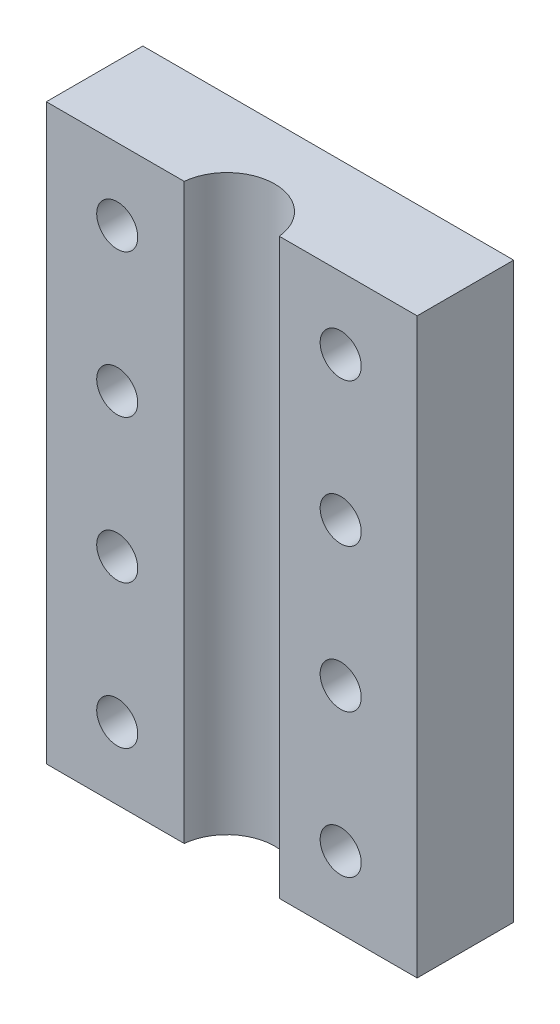
ISO-10303-21;
HEADER;
FILE_DESCRIPTION(('STEP AP214'),'2;1');
FILE_NAME('part.step','',(''),(''),'','','');
FILE_SCHEMA(('AUTOMOTIVE_DESIGN { 1 0 10303 214 1 1 1 1 }'));
ENDSEC;
DATA;
#1=APPLICATION_CONTEXT('core data for automotive mechanical design processes');
#2=APPLICATION_PROTOCOL_DEFINITION('international standard','automotive_design',2000,#1);
#3=PRODUCT_CONTEXT('',#1,'mechanical');
#4=PRODUCT('Part','Part','',(#3));
#5=PRODUCT_RELATED_PRODUCT_CATEGORY('part','',(#4));
#6=PRODUCT_DEFINITION_FORMATION('','',#4);
#7=PRODUCT_DEFINITION_CONTEXT('part definition',#1,'design');
#8=PRODUCT_DEFINITION('design','',#6,#7);
#9=PRODUCT_DEFINITION_SHAPE('','',#8);
#10=(LENGTH_UNIT() NAMED_UNIT(*) SI_UNIT(.MILLI.,.METRE.));
#11=(NAMED_UNIT(*) PLANE_ANGLE_UNIT() SI_UNIT($,.RADIAN.));
#12=(NAMED_UNIT(*) SI_UNIT($,.STERADIAN.) SOLID_ANGLE_UNIT());
#13=UNCERTAINTY_MEASURE_WITH_UNIT(LENGTH_MEASURE(1.E-05),#10,'distance_accuracy_value','');
#14=(GEOMETRIC_REPRESENTATION_CONTEXT(3) GLOBAL_UNCERTAINTY_ASSIGNED_CONTEXT((#13)) GLOBAL_UNIT_ASSIGNED_CONTEXT((#10,
#11,#12)) REPRESENTATION_CONTEXT('',''));
#15=CARTESIAN_POINT('',(0.,0.,0.));
#16=DIRECTION('',(0.,0.,1.));
#17=DIRECTION('',(1.,0.,0.));
#18=AXIS2_PLACEMENT_3D('',#15,#16,#17);
#19=CARTESIAN_POINT('',(-19.4,60.,0.));
#20=DIRECTION('',(0.,0.,-1.));
#21=DIRECTION('',(-1.,0.,0.));
#22=AXIS2_PLACEMENT_3D('',#19,#20,#21);
#23=PLANE('',#22);
#24=CARTESIAN_POINT('',(-11.98,52.5,0.));
#25=DIRECTION('',(0.,0.,-1.));
#26=DIRECTION('',(-1.,0.,0.));
#27=AXIS2_PLACEMENT_3D('',#24,#25,#26);
#28=CIRCLE('',#27,2.15);
#29=CARTESIAN_POINT('',(-14.13,52.5,0.));
#30=VERTEX_POINT('',#29);
#31=EDGE_CURVE('E165',#30,#30,#28,.T.);
#32=ORIENTED_EDGE('',*,*,#31,.T.);
#33=EDGE_LOOP('',(#32));
#34=FACE_BOUND('',#33,.T.);
#35=CARTESIAN_POINT('',(-11.98,37.5,0.));
#36=DIRECTION('',(0.,0.,-1.));
#37=DIRECTION('',(-1.,0.,0.));
#38=AXIS2_PLACEMENT_3D('',#35,#36,#37);
#39=CIRCLE('',#38,2.15);
#40=CARTESIAN_POINT('',(-14.13,37.5,0.));
#41=VERTEX_POINT('',#40);
#42=EDGE_CURVE('E189',#41,#41,#39,.T.);
#43=ORIENTED_EDGE('',*,*,#42,.T.);
#44=EDGE_LOOP('',(#43));
#45=FACE_BOUND('',#44,.T.);
#46=CARTESIAN_POINT('',(-11.98,22.5,0.));
#47=DIRECTION('',(0.,0.,-1.));
#48=DIRECTION('',(-1.,0.,0.));
#49=AXIS2_PLACEMENT_3D('',#46,#47,#48);
#50=CIRCLE('',#49,2.15);
#51=CARTESIAN_POINT('',(-14.13,22.5,0.));
#52=VERTEX_POINT('',#51);
#53=EDGE_CURVE('E183',#52,#52,#50,.T.);
#54=ORIENTED_EDGE('',*,*,#53,.T.);
#55=EDGE_LOOP('',(#54));
#56=FACE_BOUND('',#55,.T.);
#57=CARTESIAN_POINT('',(-11.98,7.5,0.));
#58=DIRECTION('',(0.,0.,-1.));
#59=DIRECTION('',(-1.,0.,0.));
#60=AXIS2_PLACEMENT_3D('',#57,#58,#59);
#61=CIRCLE('',#60,2.15);
#62=CARTESIAN_POINT('',(-14.13,7.5,0.));
#63=VERTEX_POINT('',#62);
#64=EDGE_CURVE('E177',#63,#63,#61,.T.);
#65=ORIENTED_EDGE('',*,*,#64,.T.);
#66=EDGE_LOOP('',(#65));
#67=FACE_BOUND('',#66,.T.);
#68=DIRECTION('',(1.,0.,0.));
#69=VECTOR('',#68,1.);
#70=CARTESIAN_POINT('',(-19.4,0.,0.));
#71=LINE('',#70,#69);
#72=CARTESIAN_POINT('',(-19.4,0.,0.));
#73=VERTEX_POINT('',#72);
#74=CARTESIAN_POINT('',(-4.9749371855331,0.,0.));
#75=VERTEX_POINT('',#74);
#76=EDGE_CURVE('E122',#73,#75,#71,.T.);
#77=ORIENTED_EDGE('',*,*,#76,.T.);
#78=DIRECTION('',(0.,1.,0.));
#79=VECTOR('',#78,1.);
#80=CARTESIAN_POINT('',(-4.9749371855331,0.,0.));
#81=LINE('',#80,#79);
#82=CARTESIAN_POINT('',(-4.9749371855331,60.,0.));
#83=VERTEX_POINT('',#82);
#84=EDGE_CURVE('E57',#75,#83,#81,.T.);
#85=ORIENTED_EDGE('',*,*,#84,.T.);
#86=DIRECTION('',(1.,0.,0.));
#87=VECTOR('',#86,1.);
#88=CARTESIAN_POINT('',(-19.4,60.,0.));
#89=LINE('',#88,#87);
#90=CARTESIAN_POINT('',(-19.4,60.,0.));
#91=VERTEX_POINT('',#90);
#92=EDGE_CURVE('E93',#91,#83,#89,.T.);
#93=ORIENTED_EDGE('',*,*,#92,.F.);
#94=DIRECTION('',(0.,-1.,0.));
#95=VECTOR('',#94,1.);
#96=CARTESIAN_POINT('',(-19.4,60.,0.));
#97=LINE('',#96,#95);
#98=EDGE_CURVE('E11',#91,#73,#97,.T.);
#99=ORIENTED_EDGE('',*,*,#98,.T.);
#100=EDGE_LOOP('',(#77,#85,#93,#99));
#101=FACE_BOUND('',#100,.T.);
#102=ADVANCED_FACE('F42',(#34,#45,#56,#67,#101),#23,.F.);
#103=CARTESIAN_POINT('',(-19.4,60.,-10.1));
#104=DIRECTION('',(1.,0.,0.));
#105=DIRECTION('',(0.,0.,-1.));
#106=AXIS2_PLACEMENT_3D('',#103,#104,#105);
#107=PLANE('',#106);
#108=DIRECTION('',(0.,0.,1.));
#109=VECTOR('',#108,1.);
#110=CARTESIAN_POINT('',(-19.4,0.,-10.1));
#111=LINE('',#110,#109);
#112=CARTESIAN_POINT('',(-19.4,0.,-10.1));
#113=VERTEX_POINT('',#112);
#114=EDGE_CURVE('E123',#113,#73,#111,.T.);
#115=ORIENTED_EDGE('',*,*,#114,.T.);
#116=ORIENTED_EDGE('',*,*,#98,.F.);
#117=DIRECTION('',(0.,0.,1.));
#118=VECTOR('',#117,1.);
#119=CARTESIAN_POINT('',(-19.4,60.,-10.1));
#120=LINE('',#119,#118);
#121=CARTESIAN_POINT('',(-19.4,60.,-10.1));
#122=VERTEX_POINT('',#121);
#123=EDGE_CURVE('E131',#122,#91,#120,.T.);
#124=ORIENTED_EDGE('',*,*,#123,.F.);
#125=DIRECTION('',(0.,-1.,0.));
#126=VECTOR('',#125,1.);
#127=CARTESIAN_POINT('',(-19.4,60.,-10.1));
#128=LINE('',#127,#126);
#129=EDGE_CURVE('E132',#122,#113,#128,.T.);
#130=ORIENTED_EDGE('',*,*,#129,.T.);
#131=EDGE_LOOP('',(#115,#116,#124,#130));
#132=FACE_BOUND('',#131,.T.);
#133=ADVANCED_FACE('F44',(#132),#107,.F.);
#134=CARTESIAN_POINT('',(11.4,7.5,0.));
#135=DIRECTION('',(0.,0.,-1.));
#136=DIRECTION('',(-1.,0.,0.));
#137=AXIS2_PLACEMENT_3D('',#134,#135,#136);
#138=CIRCLE('',#137,2.15);
#139=CARTESIAN_POINT('',(9.24999999999999,7.5,0.));
#140=VERTEX_POINT('',#139);
#141=EDGE_CURVE('E172',#140,#140,#138,.T.);
#142=ORIENTED_EDGE('',*,*,#141,.T.);
#143=EDGE_LOOP('',(#142));
#144=FACE_BOUND('',#143,.T.);
#145=CARTESIAN_POINT('',(11.4,22.5,0.));
#146=DIRECTION('',(0.,0.,-1.));
#147=DIRECTION('',(-1.,0.,0.));
#148=AXIS2_PLACEMENT_3D('',#145,#146,#147);
#149=CIRCLE('',#148,2.15);
#150=CARTESIAN_POINT('',(9.24999999999999,22.5,0.));
#151=VERTEX_POINT('',#150);
#152=EDGE_CURVE('E153',#151,#151,#149,.T.);
#153=ORIENTED_EDGE('',*,*,#152,.T.);
#154=EDGE_LOOP('',(#153));
#155=FACE_BOUND('',#154,.T.);
#156=CARTESIAN_POINT('',(11.4,37.5,0.));
#157=DIRECTION('',(0.,0.,-1.));
#158=DIRECTION('',(-1.,0.,0.));
#159=AXIS2_PLACEMENT_3D('',#156,#157,#158);
#160=CIRCLE('',#159,2.15);
#161=CARTESIAN_POINT('',(9.24999999999999,37.5,0.));
#162=VERTEX_POINT('',#161);
#163=EDGE_CURVE('E160',#162,#162,#160,.T.);
#164=ORIENTED_EDGE('',*,*,#163,.T.);
#165=EDGE_LOOP('',(#164));
#166=FACE_BOUND('',#165,.T.);
#167=CARTESIAN_POINT('',(11.4,52.5,0.));
#168=DIRECTION('',(0.,0.,-1.));
#169=DIRECTION('',(-1.,0.,0.));
#170=AXIS2_PLACEMENT_3D('',#167,#168,#169);
#171=CIRCLE('',#170,2.15);
#172=CARTESIAN_POINT('',(9.24999999999999,52.5,0.));
#173=VERTEX_POINT('',#172);
#174=EDGE_CURVE('E145',#173,#173,#171,.T.);
#175=ORIENTED_EDGE('',*,*,#174,.T.);
#176=EDGE_LOOP('',(#175));
#177=FACE_BOUND('',#176,.T.);
#178=CARTESIAN_POINT('',(4.9749371855331,60.,0.));
#179=VERTEX_POINT('',#178);
#180=CARTESIAN_POINT('',(19.4,60.,0.));
#181=VERTEX_POINT('',#180);
#182=EDGE_CURVE('E117',#179,#181,#89,.T.);
#183=ORIENTED_EDGE('',*,*,#182,.F.);
#184=DIRECTION('',(0.,1.,0.));
#185=VECTOR('',#184,1.);
#186=CARTESIAN_POINT('',(4.9749371855331,0.,0.));
#187=LINE('',#186,#185);
#188=CARTESIAN_POINT('',(4.9749371855331,0.,0.));
#189=VERTEX_POINT('',#188);
#190=EDGE_CURVE('E104',#179,#189,#187,.F.);
#191=ORIENTED_EDGE('',*,*,#190,.T.);
#192=CARTESIAN_POINT('',(19.4,0.,0.));
#193=VERTEX_POINT('',#192);
#194=EDGE_CURVE('E115',#189,#193,#71,.T.);
#195=ORIENTED_EDGE('',*,*,#194,.T.);
#196=DIRECTION('',(0.,-1.,0.));
#197=VECTOR('',#196,1.);
#198=CARTESIAN_POINT('',(19.4,60.,0.));
#199=LINE('',#198,#197);
#200=EDGE_CURVE('E50',#181,#193,#199,.T.);
#201=ORIENTED_EDGE('',*,*,#200,.F.);
#202=EDGE_LOOP('',(#183,#191,#195,#201));
#203=FACE_BOUND('',#202,.T.);
#204=ADVANCED_FACE('F113',(#144,#155,#166,#177,#203),#23,.F.);
#205=CARTESIAN_POINT('',(19.4,60.,-10.1));
#206=DIRECTION('',(-1.,0.,0.));
#207=DIRECTION('',(0.,0.,1.));
#208=AXIS2_PLACEMENT_3D('',#205,#206,#207);
#209=PLANE('',#208);
#210=DIRECTION('',(0.,0.,-1.));
#211=VECTOR('',#210,1.);
#212=CARTESIAN_POINT('',(19.4,0.,-10.1));
#213=LINE('',#212,#211);
#214=CARTESIAN_POINT('',(19.4,0.,-10.1));
#215=VERTEX_POINT('',#214);
#216=EDGE_CURVE('E121',#193,#215,#213,.T.);
#217=ORIENTED_EDGE('',*,*,#216,.T.);
#218=DIRECTION('',(0.,-1.,0.));
#219=VECTOR('',#218,1.);
#220=CARTESIAN_POINT('',(19.4,60.,-10.1));
#221=LINE('',#220,#219);
#222=CARTESIAN_POINT('',(19.4,60.,-10.1));
#223=VERTEX_POINT('',#222);
#224=EDGE_CURVE('E134',#223,#215,#221,.T.);
#225=ORIENTED_EDGE('',*,*,#224,.F.);
#226=DIRECTION('',(0.,0.,-1.));
#227=VECTOR('',#226,1.);
#228=CARTESIAN_POINT('',(19.4,60.,-10.1));
#229=LINE('',#228,#227);
#230=EDGE_CURVE('E139',#181,#223,#229,.T.);
#231=ORIENTED_EDGE('',*,*,#230,.F.);
#232=ORIENTED_EDGE('',*,*,#200,.T.);
#233=EDGE_LOOP('',(#217,#225,#231,#232));
#234=FACE_BOUND('',#233,.T.);
#235=ADVANCED_FACE('F137',(#234),#209,.F.);
#236=CARTESIAN_POINT('',(-19.4,60.,-10.1));
#237=DIRECTION('',(0.,0.,1.));
#238=DIRECTION('',(1.,0.,0.));
#239=AXIS2_PLACEMENT_3D('',#236,#237,#238);
#240=PLANE('',#239);
#241=CARTESIAN_POINT('',(-11.98,52.5,-10.1));
#242=DIRECTION('',(0.,0.,-1.));
#243=DIRECTION('',(-1.,0.,0.));
#244=AXIS2_PLACEMENT_3D('',#241,#242,#243);
#245=CIRCLE('',#244,2.15);
#246=CARTESIAN_POINT('',(-14.13,52.5,-10.1));
#247=VERTEX_POINT('',#246);
#248=EDGE_CURVE('E168',#247,#247,#245,.T.);
#249=ORIENTED_EDGE('',*,*,#248,.F.);
#250=EDGE_LOOP('',(#249));
#251=FACE_BOUND('',#250,.T.);
#252=CARTESIAN_POINT('',(11.4,7.5,-10.1));
#253=DIRECTION('',(0.,0.,-1.));
#254=DIRECTION('',(-1.,0.,0.));
#255=AXIS2_PLACEMENT_3D('',#252,#253,#254);
#256=CIRCLE('',#255,2.15);
#257=CARTESIAN_POINT('',(9.24999999999999,7.5,-10.1));
#258=VERTEX_POINT('',#257);
#259=EDGE_CURVE('E157',#258,#258,#256,.T.);
#260=ORIENTED_EDGE('',*,*,#259,.F.);
#261=EDGE_LOOP('',(#260));
#262=FACE_BOUND('',#261,.T.);
#263=CARTESIAN_POINT('',(11.4,22.5,-10.1));
#264=DIRECTION('',(0.,0.,-1.));
#265=DIRECTION('',(-1.,0.,0.));
#266=AXIS2_PLACEMENT_3D('',#263,#264,#265);
#267=CIRCLE('',#266,2.15);
#268=CARTESIAN_POINT('',(9.24999999999999,22.5,-10.1));
#269=VERTEX_POINT('',#268);
#270=EDGE_CURVE('E156',#269,#269,#267,.T.);
#271=ORIENTED_EDGE('',*,*,#270,.F.);
#272=EDGE_LOOP('',(#271));
#273=FACE_BOUND('',#272,.T.);
#274=CARTESIAN_POINT('',(11.4,37.5,-10.1));
#275=DIRECTION('',(0.,0.,-1.));
#276=DIRECTION('',(-1.,0.,0.));
#277=AXIS2_PLACEMENT_3D('',#274,#275,#276);
#278=CIRCLE('',#277,2.15);
#279=CARTESIAN_POINT('',(9.24999999999999,37.5,-10.1));
#280=VERTEX_POINT('',#279);
#281=EDGE_CURVE('E150',#280,#280,#278,.T.);
#282=ORIENTED_EDGE('',*,*,#281,.F.);
#283=EDGE_LOOP('',(#282));
#284=FACE_BOUND('',#283,.T.);
#285=CARTESIAN_POINT('',(-11.98,37.5,-10.1));
#286=DIRECTION('',(0.,0.,-1.));
#287=DIRECTION('',(-1.,0.,0.));
#288=AXIS2_PLACEMENT_3D('',#285,#286,#287);
#289=CIRCLE('',#288,2.15);
#290=CARTESIAN_POINT('',(-14.13,37.5,-10.1));
#291=VERTEX_POINT('',#290);
#292=EDGE_CURVE('E169',#291,#291,#289,.T.);
#293=ORIENTED_EDGE('',*,*,#292,.F.);
#294=EDGE_LOOP('',(#293));
#295=FACE_BOUND('',#294,.T.);
#296=CARTESIAN_POINT('',(-11.98,22.5,-10.1));
#297=DIRECTION('',(0.,0.,-1.));
#298=DIRECTION('',(-1.,0.,0.));
#299=AXIS2_PLACEMENT_3D('',#296,#297,#298);
#300=CIRCLE('',#299,2.15);
#301=CARTESIAN_POINT('',(-14.13,22.5,-10.1));
#302=VERTEX_POINT('',#301);
#303=EDGE_CURVE('E186',#302,#302,#300,.T.);
#304=ORIENTED_EDGE('',*,*,#303,.F.);
#305=EDGE_LOOP('',(#304));
#306=FACE_BOUND('',#305,.T.);
#307=CARTESIAN_POINT('',(-11.98,7.5,-10.1));
#308=DIRECTION('',(0.,0.,-1.));
#309=DIRECTION('',(-1.,0.,0.));
#310=AXIS2_PLACEMENT_3D('',#307,#308,#309);
#311=CIRCLE('',#310,2.15);
#312=CARTESIAN_POINT('',(-14.13,7.5,-10.1));
#313=VERTEX_POINT('',#312);
#314=EDGE_CURVE('E180',#313,#313,#311,.T.);
#315=ORIENTED_EDGE('',*,*,#314,.F.);
#316=EDGE_LOOP('',(#315));
#317=FACE_BOUND('',#316,.T.);
#318=CARTESIAN_POINT('',(11.4,52.5,-10.1));
#319=DIRECTION('',(0.,0.,-1.));
#320=DIRECTION('',(-1.,0.,0.));
#321=AXIS2_PLACEMENT_3D('',#318,#319,#320);
#322=CIRCLE('',#321,2.15);
#323=CARTESIAN_POINT('',(9.24999999999999,52.5,-10.1));
#324=VERTEX_POINT('',#323);
#325=EDGE_CURVE('E147',#324,#324,#322,.T.);
#326=ORIENTED_EDGE('',*,*,#325,.F.);
#327=EDGE_LOOP('',(#326));
#328=FACE_BOUND('',#327,.T.);
#329=DIRECTION('',(-1.,0.,0.));
#330=VECTOR('',#329,1.);
#331=CARTESIAN_POINT('',(-19.4,0.,-10.1));
#332=LINE('',#331,#330);
#333=EDGE_CURVE('E87',#215,#113,#332,.T.);
#334=ORIENTED_EDGE('',*,*,#333,.T.);
#335=ORIENTED_EDGE('',*,*,#129,.F.);
#336=DIRECTION('',(-1.,0.,0.));
#337=VECTOR('',#336,1.);
#338=CARTESIAN_POINT('',(-19.4,60.,-10.1));
#339=LINE('',#338,#337);
#340=EDGE_CURVE('E66',#223,#122,#339,.T.);
#341=ORIENTED_EDGE('',*,*,#340,.F.);
#342=ORIENTED_EDGE('',*,*,#224,.T.);
#343=EDGE_LOOP('',(#334,#335,#341,#342));
#344=FACE_BOUND('',#343,.T.);
#345=ADVANCED_FACE('F197',(#251,#262,#273,#284,#295,#306,#317,#328,#344),#240,.F.);
#346=CARTESIAN_POINT('',(0.,60.,0.));
#347=DIRECTION('',(0.,1.,0.));
#348=DIRECTION('',(0.,0.,1.));
#349=AXIS2_PLACEMENT_3D('',#346,#347,#348);
#350=PLANE('',#349);
#351=CARTESIAN_POINT('',(0.,60.,0.5));
#352=DIRECTION('',(0.,1.,0.));
#353=DIRECTION('',(0.,0.,1.));
#354=AXIS2_PLACEMENT_3D('',#351,#352,#353);
#355=CIRCLE('',#354,5.);
#356=EDGE_CURVE('E109',#179,#83,#355,.T.);
#357=ORIENTED_EDGE('',*,*,#356,.F.);
#358=ORIENTED_EDGE('',*,*,#182,.T.);
#359=ORIENTED_EDGE('',*,*,#230,.T.);
#360=ORIENTED_EDGE('',*,*,#340,.T.);
#361=ORIENTED_EDGE('',*,*,#123,.T.);
#362=ORIENTED_EDGE('',*,*,#92,.T.);
#363=EDGE_LOOP('',(#357,#358,#359,#360,#361,#362));
#364=FACE_BOUND('',#363,.T.);
#365=ADVANCED_FACE('F200',(#364),#350,.T.);
#366=CARTESIAN_POINT('',(0.,0.,0.));
#367=DIRECTION('',(0.,1.,0.));
#368=DIRECTION('',(0.,0.,1.));
#369=AXIS2_PLACEMENT_3D('',#366,#367,#368);
#370=PLANE('',#369);
#371=ORIENTED_EDGE('',*,*,#194,.F.);
#372=CARTESIAN_POINT('',(0.,0.,0.5));
#373=DIRECTION('',(0.,1.,0.));
#374=DIRECTION('',(0.,0.,1.));
#375=AXIS2_PLACEMENT_3D('',#372,#373,#374);
#376=CIRCLE('',#375,5.);
#377=EDGE_CURVE('E101',#189,#75,#376,.T.);
#378=ORIENTED_EDGE('',*,*,#377,.T.);
#379=ORIENTED_EDGE('',*,*,#76,.F.);
#380=ORIENTED_EDGE('',*,*,#114,.F.);
#381=ORIENTED_EDGE('',*,*,#333,.F.);
#382=ORIENTED_EDGE('',*,*,#216,.F.);
#383=EDGE_LOOP('',(#371,#378,#379,#380,#381,#382));
#384=FACE_BOUND('',#383,.T.);
#385=ADVANCED_FACE('F120',(#384),#370,.F.);
#386=CARTESIAN_POINT('',(0.,0.,0.5));
#387=DIRECTION('',(0.,1.,0.));
#388=DIRECTION('',(0.,0.,1.));
#389=AXIS2_PLACEMENT_3D('',#386,#387,#388);
#390=CYLINDRICAL_SURFACE('',#389,5.);
#391=ORIENTED_EDGE('',*,*,#377,.F.);
#392=ORIENTED_EDGE('',*,*,#190,.F.);
#393=ORIENTED_EDGE('',*,*,#356,.T.);
#394=ORIENTED_EDGE('',*,*,#84,.F.);
#395=EDGE_LOOP('',(#391,#392,#393,#394));
#396=FACE_BOUND('',#395,.T.);
#397=ADVANCED_FACE('F103',(#396),#390,.F.);
#398=CARTESIAN_POINT('',(11.4,52.5,0.));
#399=DIRECTION('',(0.,0.,-1.));
#400=DIRECTION('',(-1.,0.,0.));
#401=AXIS2_PLACEMENT_3D('',#398,#399,#400);
#402=CYLINDRICAL_SURFACE('',#401,2.15);
#403=ORIENTED_EDGE('',*,*,#174,.F.);
#404=EDGE_LOOP('',(#403));
#405=FACE_BOUND('',#404,.T.);
#406=ORIENTED_EDGE('',*,*,#325,.T.);
#407=EDGE_LOOP('',(#406));
#408=FACE_BOUND('',#407,.T.);
#409=ADVANCED_FACE('F209',(#405,#408),#402,.F.);
#410=CARTESIAN_POINT('',(-11.98,7.5,0.));
#411=DIRECTION('',(0.,0.,-1.));
#412=DIRECTION('',(-1.,0.,0.));
#413=AXIS2_PLACEMENT_3D('',#410,#411,#412);
#414=CYLINDRICAL_SURFACE('',#413,2.15);
#415=ORIENTED_EDGE('',*,*,#64,.F.);
#416=EDGE_LOOP('',(#415));
#417=FACE_BOUND('',#416,.T.);
#418=ORIENTED_EDGE('',*,*,#314,.T.);
#419=EDGE_LOOP('',(#418));
#420=FACE_BOUND('',#419,.T.);
#421=ADVANCED_FACE('F211',(#417,#420),#414,.F.);
#422=CARTESIAN_POINT('',(-11.98,22.5,0.));
#423=DIRECTION('',(0.,0.,-1.));
#424=DIRECTION('',(-1.,0.,0.));
#425=AXIS2_PLACEMENT_3D('',#422,#423,#424);
#426=CYLINDRICAL_SURFACE('',#425,2.15);
#427=ORIENTED_EDGE('',*,*,#53,.F.);
#428=EDGE_LOOP('',(#427));
#429=FACE_BOUND('',#428,.T.);
#430=ORIENTED_EDGE('',*,*,#303,.T.);
#431=EDGE_LOOP('',(#430));
#432=FACE_BOUND('',#431,.T.);
#433=ADVANCED_FACE('F217',(#429,#432),#426,.F.);
#434=CARTESIAN_POINT('',(-11.98,37.5,0.));
#435=DIRECTION('',(0.,0.,-1.));
#436=DIRECTION('',(-1.,0.,0.));
#437=AXIS2_PLACEMENT_3D('',#434,#435,#436);
#438=CYLINDRICAL_SURFACE('',#437,2.15);
#439=ORIENTED_EDGE('',*,*,#42,.F.);
#440=EDGE_LOOP('',(#439));
#441=FACE_BOUND('',#440,.T.);
#442=ORIENTED_EDGE('',*,*,#292,.T.);
#443=EDGE_LOOP('',(#442));
#444=FACE_BOUND('',#443,.T.);
#445=ADVANCED_FACE('F195',(#441,#444),#438,.F.);
#446=CARTESIAN_POINT('',(11.4,37.5,0.));
#447=DIRECTION('',(0.,0.,-1.));
#448=DIRECTION('',(-1.,0.,0.));
#449=AXIS2_PLACEMENT_3D('',#446,#447,#448);
#450=CYLINDRICAL_SURFACE('',#449,2.15);
#451=ORIENTED_EDGE('',*,*,#163,.F.);
#452=EDGE_LOOP('',(#451));
#453=FACE_BOUND('',#452,.T.);
#454=ORIENTED_EDGE('',*,*,#281,.T.);
#455=EDGE_LOOP('',(#454));
#456=FACE_BOUND('',#455,.T.);
#457=ADVANCED_FACE('F244',(#453,#456),#450,.F.);
#458=CARTESIAN_POINT('',(11.4,22.5,0.));
#459=DIRECTION('',(0.,0.,-1.));
#460=DIRECTION('',(-1.,0.,0.));
#461=AXIS2_PLACEMENT_3D('',#458,#459,#460);
#462=CYLINDRICAL_SURFACE('',#461,2.15);
#463=ORIENTED_EDGE('',*,*,#152,.F.);
#464=EDGE_LOOP('',(#463));
#465=FACE_BOUND('',#464,.T.);
#466=ORIENTED_EDGE('',*,*,#270,.T.);
#467=EDGE_LOOP('',(#466));
#468=FACE_BOUND('',#467,.T.);
#469=ADVANCED_FACE('F247',(#465,#468),#462,.F.);
#470=CARTESIAN_POINT('',(11.4,7.5,0.));
#471=DIRECTION('',(0.,0.,-1.));
#472=DIRECTION('',(-1.,0.,0.));
#473=AXIS2_PLACEMENT_3D('',#470,#471,#472);
#474=CYLINDRICAL_SURFACE('',#473,2.15);
#475=ORIENTED_EDGE('',*,*,#141,.F.);
#476=EDGE_LOOP('',(#475));
#477=FACE_BOUND('',#476,.T.);
#478=ORIENTED_EDGE('',*,*,#259,.T.);
#479=EDGE_LOOP('',(#478));
#480=FACE_BOUND('',#479,.T.);
#481=ADVANCED_FACE('F255',(#477,#480),#474,.F.);
#482=CARTESIAN_POINT('',(-11.98,52.5,0.));
#483=DIRECTION('',(0.,0.,-1.));
#484=DIRECTION('',(-1.,0.,0.));
#485=AXIS2_PLACEMENT_3D('',#482,#483,#484);
#486=CYLINDRICAL_SURFACE('',#485,2.15);
#487=ORIENTED_EDGE('',*,*,#31,.F.);
#488=EDGE_LOOP('',(#487));
#489=FACE_BOUND('',#488,.T.);
#490=ORIENTED_EDGE('',*,*,#248,.T.);
#491=EDGE_LOOP('',(#490));
#492=FACE_BOUND('',#491,.T.);
#493=ADVANCED_FACE('F260',(#489,#492),#486,.F.);
#494=CLOSED_SHELL('',(#102,#133,#204,#235,#345,#365,#385,#397,#409,#421,#433,#445,#457,#469,
#481,#493));
#495=MANIFOLD_SOLID_BREP('B2',#494);
#496=ADVANCED_BREP_SHAPE_REPRESENTATION('',(#18,#495),#14);
#497=SHAPE_DEFINITION_REPRESENTATION(#9,#496);
ENDSEC;
END-ISO-10303-21;
